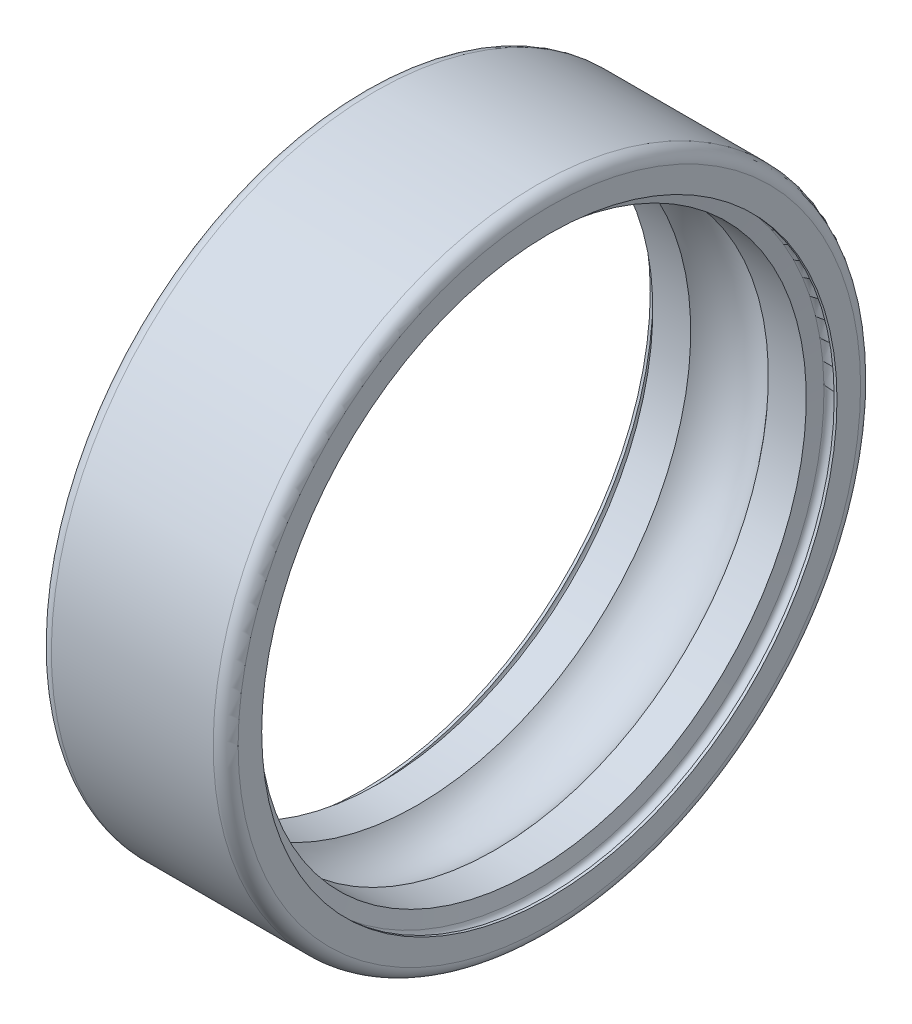
ISO-10303-21;
HEADER;
FILE_DESCRIPTION(('STEP AP214'),'2;1');
FILE_NAME('part.step','',(''),(''),'','','');
FILE_SCHEMA(('AUTOMOTIVE_DESIGN { 1 0 10303 214 1 1 1 1 }'));
ENDSEC;
DATA;
#1=APPLICATION_CONTEXT('core data for automotive mechanical design processes');
#2=APPLICATION_PROTOCOL_DEFINITION('international standard','automotive_design',2000,#1);
#3=PRODUCT_CONTEXT('',#1,'mechanical');
#4=PRODUCT('Part','Part','',(#3));
#5=PRODUCT_RELATED_PRODUCT_CATEGORY('part','',(#4));
#6=PRODUCT_DEFINITION_FORMATION('','',#4);
#7=PRODUCT_DEFINITION_CONTEXT('part definition',#1,'design');
#8=PRODUCT_DEFINITION('design','',#6,#7);
#9=PRODUCT_DEFINITION_SHAPE('','',#8);
#10=(LENGTH_UNIT() NAMED_UNIT(*) SI_UNIT(.MILLI.,.METRE.));
#11=(NAMED_UNIT(*) PLANE_ANGLE_UNIT() SI_UNIT($,.RADIAN.));
#12=(NAMED_UNIT(*) SI_UNIT($,.STERADIAN.) SOLID_ANGLE_UNIT());
#13=UNCERTAINTY_MEASURE_WITH_UNIT(LENGTH_MEASURE(1.E-05),#10,'distance_accuracy_value','');
#14=(GEOMETRIC_REPRESENTATION_CONTEXT(3) GLOBAL_UNCERTAINTY_ASSIGNED_CONTEXT((#13)) GLOBAL_UNIT_ASSIGNED_CONTEXT((#10,
#11,#12)) REPRESENTATION_CONTEXT('',''));
#15=CARTESIAN_POINT('',(0.,0.,0.));
#16=DIRECTION('',(0.,0.,1.));
#17=DIRECTION('',(1.,0.,0.));
#18=AXIS2_PLACEMENT_3D('',#15,#16,#17);
#19=CARTESIAN_POINT('',(14.322,0.,0.));
#20=DIRECTION('',(1.,0.,0.));
#21=DIRECTION('',(0.,0.,-1.));
#22=AXIS2_PLACEMENT_3D('',#19,#20,#21);
#23=TOROIDAL_SURFACE('',#22,23.105,0.452);
#24=CARTESIAN_POINT('',(14.774,0.,0.));
#25=DIRECTION('',(1.,0.,0.));
#26=DIRECTION('',(0.,1.,0.));
#27=AXIS2_PLACEMENT_3D('',#24,#25,#26);
#28=CIRCLE('',#27,23.105);
#29=CARTESIAN_POINT('',(14.774,23.105,0.));
#30=VERTEX_POINT('',#29);
#31=EDGE_CURVE('E11',#30,#30,#28,.T.);
#32=ORIENTED_EDGE('',*,*,#31,.T.);
#33=EDGE_LOOP('',(#32));
#34=FACE_BOUND('',#33,.T.);
#35=CARTESIAN_POINT('',(13.8768668956385,0.,0.));
#36=DIRECTION('',(1.,0.,0.));
#37=DIRECTION('',(0.,1.,0.));
#38=AXIS2_PLACEMENT_3D('',#35,#36,#37);
#39=CIRCLE('',#38,23.1834889763055);
#40=CARTESIAN_POINT('',(13.8768668956385,23.1834889763055,0.));
#41=VERTEX_POINT('',#40);
#42=EDGE_CURVE('E42',#41,#41,#39,.T.);
#43=ORIENTED_EDGE('',*,*,#42,.F.);
#44=EDGE_LOOP('',(#43));
#45=FACE_BOUND('',#44,.T.);
#46=ADVANCED_FACE('F16',(#34,#45),#23,.F.);
#47=CARTESIAN_POINT('',(14.887,0.,0.));
#48=DIRECTION('',(-1.,0.,0.));
#49=DIRECTION('',(0.,1.,0.));
#50=AXIS2_PLACEMENT_3D('',#47,#48,#49);
#51=CYLINDRICAL_SURFACE('',#50,23.105);
#52=CARTESIAN_POINT('',(15.,0.,0.));
#53=DIRECTION('',(1.,0.,0.));
#54=DIRECTION('',(0.,1.,0.));
#55=AXIS2_PLACEMENT_3D('',#52,#53,#54);
#56=CIRCLE('',#55,23.105);
#57=CARTESIAN_POINT('',(15.,23.105,0.));
#58=VERTEX_POINT('',#57);
#59=EDGE_CURVE('E26',#58,#58,#56,.T.);
#60=ORIENTED_EDGE('',*,*,#59,.T.);
#61=EDGE_LOOP('',(#60));
#62=FACE_BOUND('',#61,.T.);
#63=ORIENTED_EDGE('',*,*,#31,.F.);
#64=EDGE_LOOP('',(#63));
#65=FACE_BOUND('',#64,.T.);
#66=ADVANCED_FACE('F126',(#62,#65),#51,.F.);
#67=CARTESIAN_POINT('',(15.,24.0525,0.));
#68=DIRECTION('',(1.,0.,0.));
#69=DIRECTION('',(0.,1.,0.));
#70=AXIS2_PLACEMENT_3D('',#67,#68,#69);
#71=PLANE('',#70);
#72=CARTESIAN_POINT('',(15.,0.,0.));
#73=DIRECTION('',(1.,0.,0.));
#74=DIRECTION('',(0.,1.,0.));
#75=AXIS2_PLACEMENT_3D('',#72,#73,#74);
#76=CIRCLE('',#75,25.);
#77=CARTESIAN_POINT('',(15.,25.,0.));
#78=VERTEX_POINT('',#77);
#79=EDGE_CURVE('E20',#78,#78,#76,.T.);
#80=ORIENTED_EDGE('',*,*,#79,.T.);
#81=EDGE_LOOP('',(#80));
#82=FACE_BOUND('',#81,.T.);
#83=ORIENTED_EDGE('',*,*,#59,.F.);
#84=EDGE_LOOP('',(#83));
#85=FACE_BOUND('',#84,.T.);
#86=ADVANCED_FACE('F79',(#82,#85),#71,.T.);
#87=CARTESIAN_POINT('',(14.,0.,0.));
#88=DIRECTION('',(1.,0.,0.));
#89=DIRECTION('',(0.,0.,-1.));
#90=AXIS2_PLACEMENT_3D('',#87,#88,#89);
#91=TOROIDAL_SURFACE('',#90,25.,1.);
#92=CARTESIAN_POINT('',(14.,0.,0.));
#93=DIRECTION('',(1.,0.,0.));
#94=DIRECTION('',(0.,1.,0.));
#95=AXIS2_PLACEMENT_3D('',#92,#93,#94);
#96=CIRCLE('',#95,26.);
#97=CARTESIAN_POINT('',(14.,26.,0.));
#98=VERTEX_POINT('',#97);
#99=EDGE_CURVE('E82',#98,#98,#96,.T.);
#100=ORIENTED_EDGE('',*,*,#99,.T.);
#101=EDGE_LOOP('',(#100));
#102=FACE_BOUND('',#101,.T.);
#103=ORIENTED_EDGE('',*,*,#79,.F.);
#104=EDGE_LOOP('',(#103));
#105=FACE_BOUND('',#104,.T.);
#106=ADVANCED_FACE('F137',(#102,#105),#91,.T.);
#107=CARTESIAN_POINT('',(7.5,0.,0.));
#108=DIRECTION('',(-1.,0.,0.));
#109=DIRECTION('',(0.,1.,0.));
#110=AXIS2_PLACEMENT_3D('',#107,#108,#109);
#111=CYLINDRICAL_SURFACE('',#110,26.);
#112=CARTESIAN_POINT('',(1.,0.,0.));
#113=DIRECTION('',(1.,0.,0.));
#114=DIRECTION('',(0.,1.,0.));
#115=AXIS2_PLACEMENT_3D('',#112,#113,#114);
#116=CIRCLE('',#115,26.);
#117=CARTESIAN_POINT('',(1.,26.,0.));
#118=VERTEX_POINT('',#117);
#119=EDGE_CURVE('E84',#118,#118,#116,.T.);
#120=ORIENTED_EDGE('',*,*,#119,.T.);
#121=EDGE_LOOP('',(#120));
#122=FACE_BOUND('',#121,.T.);
#123=ORIENTED_EDGE('',*,*,#99,.F.);
#124=EDGE_LOOP('',(#123));
#125=FACE_BOUND('',#124,.T.);
#126=ADVANCED_FACE('F122',(#122,#125),#111,.T.);
#127=CARTESIAN_POINT('',(1.,0.,0.));
#128=DIRECTION('',(1.,0.,0.));
#129=DIRECTION('',(0.,0.,-1.));
#130=AXIS2_PLACEMENT_3D('',#127,#128,#129);
#131=TOROIDAL_SURFACE('',#130,25.,1.);
#132=CARTESIAN_POINT('',(0.,0.,0.));
#133=DIRECTION('',(1.,0.,0.));
#134=DIRECTION('',(0.,1.,0.));
#135=AXIS2_PLACEMENT_3D('',#132,#133,#134);
#136=CIRCLE('',#135,25.);
#137=CARTESIAN_POINT('',(0.,25.,0.));
#138=VERTEX_POINT('',#137);
#139=EDGE_CURVE('E88',#138,#138,#136,.T.);
#140=ORIENTED_EDGE('',*,*,#139,.T.);
#141=EDGE_LOOP('',(#140));
#142=FACE_BOUND('',#141,.T.);
#143=ORIENTED_EDGE('',*,*,#119,.F.);
#144=EDGE_LOOP('',(#143));
#145=FACE_BOUND('',#144,.T.);
#146=ADVANCED_FACE('F106',(#142,#145),#131,.T.);
#147=CARTESIAN_POINT('',(0.,24.0525,0.));
#148=DIRECTION('',(-1.,0.,0.));
#149=DIRECTION('',(0.,-1.,0.));
#150=AXIS2_PLACEMENT_3D('',#147,#148,#149);
#151=PLANE('',#150);
#152=CARTESIAN_POINT('',(0.,0.,0.));
#153=DIRECTION('',(1.,0.,0.));
#154=DIRECTION('',(0.,1.,0.));
#155=AXIS2_PLACEMENT_3D('',#152,#153,#154);
#156=CIRCLE('',#155,23.105);
#157=CARTESIAN_POINT('',(0.,23.105,0.));
#158=VERTEX_POINT('',#157);
#159=EDGE_CURVE('E94',#158,#158,#156,.T.);
#160=ORIENTED_EDGE('',*,*,#159,.T.);
#161=EDGE_LOOP('',(#160));
#162=FACE_BOUND('',#161,.T.);
#163=ORIENTED_EDGE('',*,*,#139,.F.);
#164=EDGE_LOOP('',(#163));
#165=FACE_BOUND('',#164,.T.);
#166=ADVANCED_FACE('F109',(#162,#165),#151,.T.);
#167=CARTESIAN_POINT('',(0.113,0.,0.));
#168=DIRECTION('',(-1.,0.,0.));
#169=DIRECTION('',(0.,1.,0.));
#170=AXIS2_PLACEMENT_3D('',#167,#168,#169);
#171=CYLINDRICAL_SURFACE('',#170,23.105);
#172=CARTESIAN_POINT('',(0.226,0.,0.));
#173=DIRECTION('',(1.,0.,0.));
#174=DIRECTION('',(0.,1.,0.));
#175=AXIS2_PLACEMENT_3D('',#172,#173,#174);
#176=CIRCLE('',#175,23.105);
#177=CARTESIAN_POINT('',(0.226,23.105,0.));
#178=VERTEX_POINT('',#177);
#179=EDGE_CURVE('E95',#178,#178,#176,.T.);
#180=ORIENTED_EDGE('',*,*,#179,.T.);
#181=EDGE_LOOP('',(#180));
#182=FACE_BOUND('',#181,.T.);
#183=ORIENTED_EDGE('',*,*,#159,.F.);
#184=EDGE_LOOP('',(#183));
#185=FACE_BOUND('',#184,.T.);
#186=ADVANCED_FACE('F111',(#182,#185),#171,.F.);
#187=CARTESIAN_POINT('',(0.678,0.,0.));
#188=DIRECTION('',(1.,0.,0.));
#189=DIRECTION('',(0.,0.,-1.));
#190=AXIS2_PLACEMENT_3D('',#187,#188,#189);
#191=TOROIDAL_SURFACE('',#190,23.105,0.452);
#192=CARTESIAN_POINT('',(1.12313310436152,0.,0.));
#193=DIRECTION('',(1.,0.,0.));
#194=DIRECTION('',(0.,1.,0.));
#195=AXIS2_PLACEMENT_3D('',#192,#193,#194);
#196=CIRCLE('',#195,23.1834889763055);
#197=CARTESIAN_POINT('',(1.12313310436152,23.1834889763055,0.));
#198=VERTEX_POINT('',#197);
#199=EDGE_CURVE('E93',#198,#198,#196,.T.);
#200=ORIENTED_EDGE('',*,*,#199,.T.);
#201=EDGE_LOOP('',(#200));
#202=FACE_BOUND('',#201,.T.);
#203=ORIENTED_EDGE('',*,*,#179,.F.);
#204=EDGE_LOOP('',(#203));
#205=FACE_BOUND('',#204,.T.);
#206=ADVANCED_FACE('F119',(#202,#205),#191,.F.);
#207=CARTESIAN_POINT('',(1.22967771056722,0.,0.));
#208=DIRECTION('',(-1.,0.,0.));
#209=DIRECTION('',(0.,1.,0.));
#210=AXIS2_PLACEMENT_3D('',#207,#208,#209);
#211=CONICAL_SURFACE('',#210,22.5792444881527,1.39626340159546);
#212=CARTESIAN_POINT('',(1.33622231677292,0.,0.));
#213=DIRECTION('',(1.,0.,0.));
#214=DIRECTION('',(0.,1.,0.));
#215=AXIS2_PLACEMENT_3D('',#212,#213,#214);
#216=CIRCLE('',#215,21.975);
#217=CARTESIAN_POINT('',(1.33622231677292,21.975,0.));
#218=VERTEX_POINT('',#217);
#219=EDGE_CURVE('E73',#218,#218,#216,.T.);
#220=ORIENTED_EDGE('',*,*,#219,.T.);
#221=EDGE_LOOP('',(#220));
#222=FACE_BOUND('',#221,.T.);
#223=ORIENTED_EDGE('',*,*,#199,.F.);
#224=EDGE_LOOP('',(#223));
#225=FACE_BOUND('',#224,.T.);
#226=ADVANCED_FACE('F145',(#222,#225),#211,.F.);
#227=CARTESIAN_POINT('',(2.85878951100258,0.,0.));
#228=DIRECTION('',(-1.,0.,0.));
#229=DIRECTION('',(0.,1.,0.));
#230=AXIS2_PLACEMENT_3D('',#227,#228,#229);
#231=CYLINDRICAL_SURFACE('',#230,21.975);
#232=CARTESIAN_POINT('',(4.38135670523223,0.,0.));
#233=DIRECTION('',(1.,0.,0.));
#234=DIRECTION('',(0.,1.,0.));
#235=AXIS2_PLACEMENT_3D('',#232,#233,#234);
#236=CIRCLE('',#235,21.975);
#237=CARTESIAN_POINT('',(4.38135670523223,21.975,0.));
#238=VERTEX_POINT('',#237);
#239=EDGE_CURVE('E68',#238,#238,#236,.T.);
#240=ORIENTED_EDGE('',*,*,#239,.T.);
#241=EDGE_LOOP('',(#240));
#242=FACE_BOUND('',#241,.T.);
#243=ORIENTED_EDGE('',*,*,#219,.F.);
#244=EDGE_LOOP('',(#243));
#245=FACE_BOUND('',#244,.T.);
#246=ADVANCED_FACE('F143',(#242,#245),#231,.F.);
#247=CARTESIAN_POINT('',(7.5,0.,0.));
#248=DIRECTION('',(1.,0.,0.));
#249=DIRECTION('',(0.,0.,-1.));
#250=AXIS2_PLACEMENT_3D('',#247,#248,#249);
#251=TOROIDAL_SURFACE('',#250,19.52,3.969);
#252=CARTESIAN_POINT('',(10.6186432947678,0.,0.));
#253=DIRECTION('',(1.,0.,0.));
#254=DIRECTION('',(0.,1.,0.));
#255=AXIS2_PLACEMENT_3D('',#252,#253,#254);
#256=CIRCLE('',#255,21.975);
#257=CARTESIAN_POINT('',(10.6186432947678,21.975,0.));
#258=VERTEX_POINT('',#257);
#259=EDGE_CURVE('E97',#258,#258,#256,.T.);
#260=ORIENTED_EDGE('',*,*,#259,.T.);
#261=EDGE_LOOP('',(#260));
#262=FACE_BOUND('',#261,.T.);
#263=ORIENTED_EDGE('',*,*,#239,.F.);
#264=EDGE_LOOP('',(#263));
#265=FACE_BOUND('',#264,.T.);
#266=ADVANCED_FACE('F140',(#262,#265),#251,.F.);
#267=CARTESIAN_POINT('',(12.1412104889974,0.,0.));
#268=DIRECTION('',(-1.,0.,0.));
#269=DIRECTION('',(0.,1.,0.));
#270=AXIS2_PLACEMENT_3D('',#267,#268,#269);
#271=CYLINDRICAL_SURFACE('',#270,21.975);
#272=CARTESIAN_POINT('',(13.6637776832271,0.,0.));
#273=DIRECTION('',(1.,0.,0.));
#274=DIRECTION('',(0.,1.,0.));
#275=AXIS2_PLACEMENT_3D('',#272,#273,#274);
#276=CIRCLE('',#275,21.975);
#277=CARTESIAN_POINT('',(13.6637776832271,21.975,0.));
#278=VERTEX_POINT('',#277);
#279=EDGE_CURVE('E49',#278,#278,#276,.T.);
#280=ORIENTED_EDGE('',*,*,#279,.T.);
#281=EDGE_LOOP('',(#280));
#282=FACE_BOUND('',#281,.T.);
#283=ORIENTED_EDGE('',*,*,#259,.F.);
#284=EDGE_LOOP('',(#283));
#285=FACE_BOUND('',#284,.T.);
#286=ADVANCED_FACE('F142',(#282,#285),#271,.F.);
#287=CARTESIAN_POINT('',(13.7703222894328,0.,0.));
#288=DIRECTION('',(1.,0.,0.));
#289=DIRECTION('',(0.,1.,0.));
#290=AXIS2_PLACEMENT_3D('',#287,#288,#289);
#291=CONICAL_SURFACE('',#290,22.5792444881527,1.39626340159547);
#292=ORIENTED_EDGE('',*,*,#42,.T.);
#293=EDGE_LOOP('',(#292));
#294=FACE_BOUND('',#293,.T.);
#295=ORIENTED_EDGE('',*,*,#279,.F.);
#296=EDGE_LOOP('',(#295));
#297=FACE_BOUND('',#296,.T.);
#298=ADVANCED_FACE('F18',(#294,#297),#291,.F.);
#299=CLOSED_SHELL('',(#46,#66,#86,#106,#126,#146,#166,#186,#206,#226,#246,#266,#286,#298));
#300=MANIFOLD_SOLID_BREP('B1',#299);
#301=ADVANCED_BREP_SHAPE_REPRESENTATION('',(#18,#300),#14);
#302=SHAPE_DEFINITION_REPRESENTATION(#9,#301);
ENDSEC;
END-ISO-10303-21;
